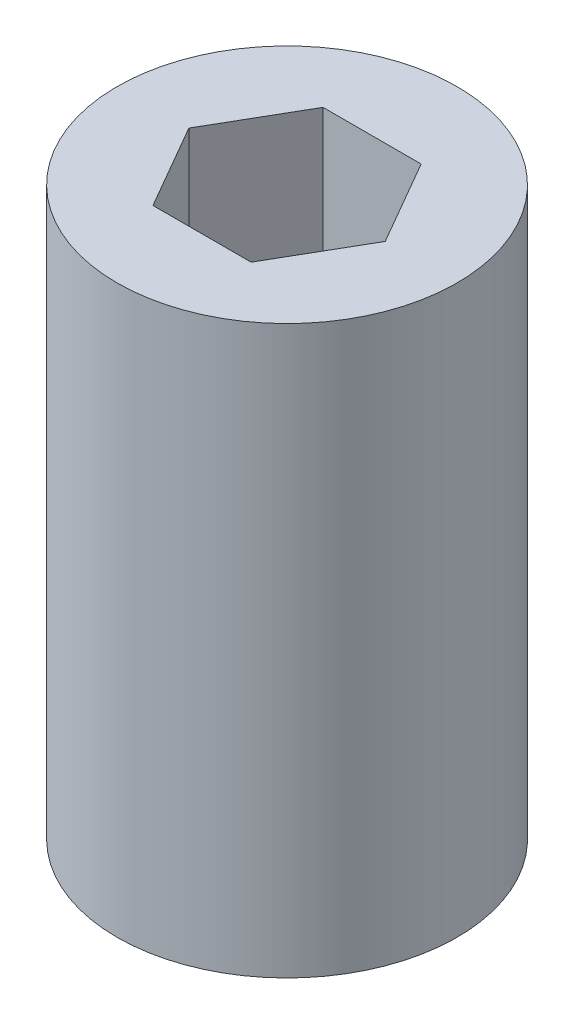
ISO-10303-21;
HEADER;
FILE_DESCRIPTION(('STEP AP214'),'2;1');
FILE_NAME('part.step','',(''),(''),'','','');
FILE_SCHEMA(('AUTOMOTIVE_DESIGN { 1 0 10303 214 1 1 1 1 }'));
ENDSEC;
DATA;
#1=APPLICATION_CONTEXT('core data for automotive mechanical design processes');
#2=APPLICATION_PROTOCOL_DEFINITION('international standard','automotive_design',2000,#1);
#3=PRODUCT_CONTEXT('',#1,'mechanical');
#4=PRODUCT('Part','Part','',(#3));
#5=PRODUCT_RELATED_PRODUCT_CATEGORY('part','',(#4));
#6=PRODUCT_DEFINITION_FORMATION('','',#4);
#7=PRODUCT_DEFINITION_CONTEXT('part definition',#1,'design');
#8=PRODUCT_DEFINITION('design','',#6,#7);
#9=PRODUCT_DEFINITION_SHAPE('','',#8);
#10=(LENGTH_UNIT() NAMED_UNIT(*) SI_UNIT(.MILLI.,.METRE.));
#11=(NAMED_UNIT(*) PLANE_ANGLE_UNIT() SI_UNIT($,.RADIAN.));
#12=(NAMED_UNIT(*) SI_UNIT($,.STERADIAN.) SOLID_ANGLE_UNIT());
#13=UNCERTAINTY_MEASURE_WITH_UNIT(LENGTH_MEASURE(1.E-05),#10,'distance_accuracy_value','');
#14=(GEOMETRIC_REPRESENTATION_CONTEXT(3) GLOBAL_UNCERTAINTY_ASSIGNED_CONTEXT((#13)) GLOBAL_UNIT_ASSIGNED_CONTEXT((#10,
#11,#12)) REPRESENTATION_CONTEXT('',''));
#15=CARTESIAN_POINT('',(0.,0.,0.));
#16=DIRECTION('',(0.,0.,1.));
#17=DIRECTION('',(1.,0.,0.));
#18=AXIS2_PLACEMENT_3D('',#15,#16,#17);
#19=CARTESIAN_POINT('',(0.,-5.5,0.));
#20=DIRECTION('',(0.,1.,0.));
#21=DIRECTION('',(0.,0.,1.));
#22=AXIS2_PLACEMENT_3D('',#19,#20,#21);
#23=CYLINDRICAL_SURFACE('',#22,0.75);
#24=CARTESIAN_POINT('',(0.,-5.5,0.));
#25=DIRECTION('',(0.,-1.,0.));
#26=DIRECTION('',(0.,0.,-1.));
#27=AXIS2_PLACEMENT_3D('',#24,#25,#26);
#28=CIRCLE('',#27,0.75);
#29=CARTESIAN_POINT('',(0.,-5.5,-0.75));
#30=VERTEX_POINT('',#29);
#31=EDGE_CURVE('E11',#30,#30,#28,.T.);
#32=ORIENTED_EDGE('',*,*,#31,.F.);
#33=EDGE_LOOP('',(#32));
#34=FACE_BOUND('',#33,.T.);
#35=CARTESIAN_POINT('',(0.,-5.,0.));
#36=DIRECTION('',(0.,-1.,0.));
#37=DIRECTION('',(0.,0.,-1.));
#38=AXIS2_PLACEMENT_3D('',#35,#36,#37);
#39=CIRCLE('',#38,0.75);
#40=CARTESIAN_POINT('',(0.,-5.,-0.75));
#41=VERTEX_POINT('',#40);
#42=EDGE_CURVE('E47',#41,#41,#39,.T.);
#43=ORIENTED_EDGE('',*,*,#42,.T.);
#44=EDGE_LOOP('',(#43));
#45=FACE_BOUND('',#44,.T.);
#46=ADVANCED_FACE('F44',(#34,#45),#23,.T.);
#47=CARTESIAN_POINT('',(0.,-5.5,0.));
#48=DIRECTION('',(0.,-1.,0.));
#49=DIRECTION('',(0.,0.,-1.));
#50=AXIS2_PLACEMENT_3D('',#47,#48,#49);
#51=PLANE('',#50);
#52=ORIENTED_EDGE('',*,*,#31,.T.);
#53=EDGE_LOOP('',(#52));
#54=FACE_BOUND('',#53,.T.);
#55=ADVANCED_FACE('F59',(#54),#51,.T.);
#56=CARTESIAN_POINT('',(0.,-5.,0.));
#57=DIRECTION('',(0.,-1.,0.));
#58=DIRECTION('',(0.,0.,-1.));
#59=AXIS2_PLACEMENT_3D('',#56,#57,#58);
#60=PLANE('',#59);
#61=ORIENTED_EDGE('',*,*,#42,.F.);
#62=EDGE_LOOP('',(#61));
#63=FACE_BOUND('',#62,.T.);
#64=ADVANCED_FACE('F57',(#63),#60,.F.);
#65=CLOSED_SHELL('',(#46,#55,#64));
#66=MANIFOLD_SOLID_BREP('B2',#65);
#67=CARTESIAN_POINT('',(0.,-5.,0.));
#68=DIRECTION('',(0.,1.,0.));
#69=DIRECTION('',(0.,0.,1.));
#70=AXIS2_PLACEMENT_3D('',#67,#68,#69);
#71=PLANE('',#70);
#72=CARTESIAN_POINT('',(0.,-5.,0.));
#73=DIRECTION('',(0.,1.,0.));
#74=DIRECTION('',(0.,0.,1.));
#75=AXIS2_PLACEMENT_3D('',#72,#73,#74);
#76=CIRCLE('',#75,1.50000000000001);
#77=CARTESIAN_POINT('',(0.,-5.,1.50000000000001));
#78=VERTEX_POINT('',#77);
#79=EDGE_CURVE('E42',#78,#78,#76,.T.);
#80=ORIENTED_EDGE('',*,*,#79,.F.);
#81=EDGE_LOOP('',(#80));
#82=FACE_BOUND('',#81,.T.);
#83=ADVANCED_FACE('F84',(#82),#71,.F.);
#84=CARTESIAN_POINT('',(0.,61.6916426261037,0.));
#85=DIRECTION('',(0.,1.,0.));
#86=DIRECTION('',(0.,0.,1.));
#87=AXIS2_PLACEMENT_3D('',#84,#85,#86);
#88=CYLINDRICAL_SURFACE('',#87,1.50000000000001);
#89=CARTESIAN_POINT('',(0.,0.,0.));
#90=DIRECTION('',(0.,1.,0.));
#91=DIRECTION('',(0.,0.,1.));
#92=AXIS2_PLACEMENT_3D('',#89,#90,#91);
#93=CIRCLE('',#92,1.50000000000001);
#94=CARTESIAN_POINT('',(0.,0.,1.50000000000001));
#95=VERTEX_POINT('',#94);
#96=EDGE_CURVE('E91',#95,#95,#93,.T.);
#97=ORIENTED_EDGE('',*,*,#96,.F.);
#98=EDGE_LOOP('',(#97));
#99=FACE_BOUND('',#98,.T.);
#100=ORIENTED_EDGE('',*,*,#79,.T.);
#101=EDGE_LOOP('',(#100));
#102=FACE_BOUND('',#101,.T.);
#103=ADVANCED_FACE('F194',(#99,#102),#88,.T.);
#104=CARTESIAN_POINT('',(1.50000000000001,0.,0.));
#105=DIRECTION('',(0.,-1.,0.));
#106=DIRECTION('',(0.,0.,-1.));
#107=AXIS2_PLACEMENT_3D('',#104,#105,#106);
#108=PLANE('',#107);
#109=DIRECTION('',(-1.,0.,0.));
#110=VECTOR('',#109,1.);
#111=CARTESIAN_POINT('',(0.433012701892219,0.,-0.75));
#112=LINE('',#111,#110);
#113=CARTESIAN_POINT('',(0.433012701892219,0.,-0.75));
#114=VERTEX_POINT('',#113);
#115=CARTESIAN_POINT('',(-0.433012701892219,0.,-0.75));
#116=VERTEX_POINT('',#115);
#117=EDGE_CURVE('E172',#114,#116,#112,.T.);
#118=ORIENTED_EDGE('',*,*,#117,.F.);
#119=DIRECTION('',(-0.5,0.,-0.866025403784439));
#120=VECTOR('',#119,1.);
#121=CARTESIAN_POINT('',(0.866025403784439,0.,0.));
#122=LINE('',#121,#120);
#123=CARTESIAN_POINT('',(0.866025403784439,0.,0.));
#124=VERTEX_POINT('',#123);
#125=EDGE_CURVE('E98',#124,#114,#122,.T.);
#126=ORIENTED_EDGE('',*,*,#125,.F.);
#127=DIRECTION('',(0.5,0.,-0.866025403784439));
#128=VECTOR('',#127,1.);
#129=CARTESIAN_POINT('',(0.433012701892219,0.,0.75));
#130=LINE('',#129,#128);
#131=CARTESIAN_POINT('',(0.433012701892219,0.,0.75));
#132=VERTEX_POINT('',#131);
#133=EDGE_CURVE('E181',#132,#124,#130,.T.);
#134=ORIENTED_EDGE('',*,*,#133,.F.);
#135=DIRECTION('',(1.,0.,0.));
#136=VECTOR('',#135,1.);
#137=CARTESIAN_POINT('',(-0.433012701892219,0.,0.75));
#138=LINE('',#137,#136);
#139=CARTESIAN_POINT('',(-0.433012701892219,0.,0.75));
#140=VERTEX_POINT('',#139);
#141=EDGE_CURVE('E179',#140,#132,#138,.T.);
#142=ORIENTED_EDGE('',*,*,#141,.F.);
#143=DIRECTION('',(0.5,0.,0.866025403784438));
#144=VECTOR('',#143,1.);
#145=CARTESIAN_POINT('',(-0.866025403784438,0.,0.));
#146=LINE('',#145,#144);
#147=CARTESIAN_POINT('',(-0.866025403784438,0.,0.));
#148=VERTEX_POINT('',#147);
#149=EDGE_CURVE('E146',#148,#140,#146,.T.);
#150=ORIENTED_EDGE('',*,*,#149,.F.);
#151=DIRECTION('',(-0.5,0.,0.866025403784439));
#152=VECTOR('',#151,1.);
#153=CARTESIAN_POINT('',(-0.433012701892219,0.,-0.75));
#154=LINE('',#153,#152);
#155=EDGE_CURVE('E175',#116,#148,#154,.T.);
#156=ORIENTED_EDGE('',*,*,#155,.F.);
#157=EDGE_LOOP('',(#118,#126,#134,#142,#150,#156));
#158=FACE_BOUND('',#157,.T.);
#159=ORIENTED_EDGE('',*,*,#96,.T.);
#160=EDGE_LOOP('',(#159));
#161=FACE_BOUND('',#160,.T.);
#162=ADVANCED_FACE('F192',(#158,#161),#108,.F.);
#163=CARTESIAN_POINT('',(0.866025403784439,-2.,0.));
#164=DIRECTION('',(0.866025403784439,0.,-0.5));
#165=DIRECTION('',(-0.5,0.,-0.866025403784439));
#166=AXIS2_PLACEMENT_3D('',#163,#164,#165);
#167=PLANE('',#166);
#168=ORIENTED_EDGE('',*,*,#125,.T.);
#169=DIRECTION('',(0.,1.,0.));
#170=VECTOR('',#169,1.);
#171=CARTESIAN_POINT('',(0.433012701892219,-2.,-0.75));
#172=LINE('',#171,#170);
#173=CARTESIAN_POINT('',(0.433012701892219,-2.,-0.75));
#174=VERTEX_POINT('',#173);
#175=EDGE_CURVE('E128',#174,#114,#172,.T.);
#176=ORIENTED_EDGE('',*,*,#175,.F.);
#177=DIRECTION('',(-0.5,0.,-0.866025403784439));
#178=VECTOR('',#177,1.);
#179=CARTESIAN_POINT('',(0.866025403784439,-2.,0.));
#180=LINE('',#179,#178);
#181=CARTESIAN_POINT('',(0.866025403784439,-2.,0.));
#182=VERTEX_POINT('',#181);
#183=EDGE_CURVE('E183',#182,#174,#180,.T.);
#184=ORIENTED_EDGE('',*,*,#183,.F.);
#185=DIRECTION('',(0.,1.,0.));
#186=VECTOR('',#185,1.);
#187=CARTESIAN_POINT('',(0.866025403784439,-2.,0.));
#188=LINE('',#187,#186);
#189=EDGE_CURVE('E106',#182,#124,#188,.T.);
#190=ORIENTED_EDGE('',*,*,#189,.T.);
#191=EDGE_LOOP('',(#168,#176,#184,#190));
#192=FACE_BOUND('',#191,.T.);
#193=ADVANCED_FACE('F212',(#192),#167,.F.);
#194=CARTESIAN_POINT('',(0.433012701892219,-2.,0.75));
#195=DIRECTION('',(0.866025403784439,0.,0.5));
#196=DIRECTION('',(0.5,0.,-0.866025403784439));
#197=AXIS2_PLACEMENT_3D('',#194,#195,#196);
#198=PLANE('',#197);
#199=ORIENTED_EDGE('',*,*,#133,.T.);
#200=ORIENTED_EDGE('',*,*,#189,.F.);
#201=DIRECTION('',(0.5,0.,-0.866025403784439));
#202=VECTOR('',#201,1.);
#203=CARTESIAN_POINT('',(0.433012701892219,-2.,0.75));
#204=LINE('',#203,#202);
#205=CARTESIAN_POINT('',(0.433012701892219,-2.,0.75));
#206=VERTEX_POINT('',#205);
#207=EDGE_CURVE('E158',#206,#182,#204,.T.);
#208=ORIENTED_EDGE('',*,*,#207,.F.);
#209=DIRECTION('',(0.,1.,0.));
#210=VECTOR('',#209,1.);
#211=CARTESIAN_POINT('',(0.433012701892219,-2.,0.75));
#212=LINE('',#211,#210);
#213=EDGE_CURVE('E150',#206,#132,#212,.T.);
#214=ORIENTED_EDGE('',*,*,#213,.T.);
#215=EDGE_LOOP('',(#199,#200,#208,#214));
#216=FACE_BOUND('',#215,.T.);
#217=ADVANCED_FACE('F220',(#216),#198,.F.);
#218=CARTESIAN_POINT('',(-0.433012701892219,-2.,0.75));
#219=DIRECTION('',(0.,0.,1.));
#220=DIRECTION('',(1.,0.,0.));
#221=AXIS2_PLACEMENT_3D('',#218,#219,#220);
#222=PLANE('',#221);
#223=ORIENTED_EDGE('',*,*,#141,.T.);
#224=ORIENTED_EDGE('',*,*,#213,.F.);
#225=DIRECTION('',(1.,0.,0.));
#226=VECTOR('',#225,1.);
#227=CARTESIAN_POINT('',(-0.433012701892219,-2.,0.75));
#228=LINE('',#227,#226);
#229=CARTESIAN_POINT('',(-0.433012701892219,-2.,0.75));
#230=VERTEX_POINT('',#229);
#231=EDGE_CURVE('E154',#230,#206,#228,.T.);
#232=ORIENTED_EDGE('',*,*,#231,.F.);
#233=DIRECTION('',(0.,1.,0.));
#234=VECTOR('',#233,1.);
#235=CARTESIAN_POINT('',(-0.433012701892219,-2.,0.75));
#236=LINE('',#235,#234);
#237=EDGE_CURVE('E139',#230,#140,#236,.T.);
#238=ORIENTED_EDGE('',*,*,#237,.T.);
#239=EDGE_LOOP('',(#223,#224,#232,#238));
#240=FACE_BOUND('',#239,.T.);
#241=ADVANCED_FACE('F155',(#240),#222,.F.);
#242=CARTESIAN_POINT('',(-0.866025403784438,-2.,0.));
#243=DIRECTION('',(-0.866025403784438,0.,0.5));
#244=DIRECTION('',(0.5,0.,0.866025403784439));
#245=AXIS2_PLACEMENT_3D('',#242,#243,#244);
#246=PLANE('',#245);
#247=ORIENTED_EDGE('',*,*,#149,.T.);
#248=ORIENTED_EDGE('',*,*,#237,.F.);
#249=DIRECTION('',(0.5,0.,0.866025403784438));
#250=VECTOR('',#249,1.);
#251=CARTESIAN_POINT('',(-0.866025403784438,-2.,0.));
#252=LINE('',#251,#250);
#253=CARTESIAN_POINT('',(-0.866025403784438,-2.,0.));
#254=VERTEX_POINT('',#253);
#255=EDGE_CURVE('E143',#254,#230,#252,.T.);
#256=ORIENTED_EDGE('',*,*,#255,.F.);
#257=DIRECTION('',(0.,1.,0.));
#258=VECTOR('',#257,1.);
#259=CARTESIAN_POINT('',(-0.866025403784438,-2.,0.));
#260=LINE('',#259,#258);
#261=EDGE_CURVE('E151',#254,#148,#260,.T.);
#262=ORIENTED_EDGE('',*,*,#261,.T.);
#263=EDGE_LOOP('',(#247,#248,#256,#262));
#264=FACE_BOUND('',#263,.T.);
#265=ADVANCED_FACE('F141',(#264),#246,.F.);
#266=CARTESIAN_POINT('',(-0.433012701892219,-2.,-0.75));
#267=DIRECTION('',(-0.866025403784439,0.,-0.5));
#268=DIRECTION('',(-0.5,0.,0.866025403784439));
#269=AXIS2_PLACEMENT_3D('',#266,#267,#268);
#270=PLANE('',#269);
#271=ORIENTED_EDGE('',*,*,#155,.T.);
#272=ORIENTED_EDGE('',*,*,#261,.F.);
#273=DIRECTION('',(-0.5,0.,0.866025403784439));
#274=VECTOR('',#273,1.);
#275=CARTESIAN_POINT('',(-0.433012701892219,-2.,-0.75));
#276=LINE('',#275,#274);
#277=CARTESIAN_POINT('',(-0.433012701892219,-2.,-0.75));
#278=VERTEX_POINT('',#277);
#279=EDGE_CURVE('E164',#278,#254,#276,.T.);
#280=ORIENTED_EDGE('',*,*,#279,.F.);
#281=DIRECTION('',(0.,1.,0.));
#282=VECTOR('',#281,1.);
#283=CARTESIAN_POINT('',(-0.433012701892219,-2.,-0.75));
#284=LINE('',#283,#282);
#285=EDGE_CURVE('E187',#278,#116,#284,.T.);
#286=ORIENTED_EDGE('',*,*,#285,.T.);
#287=EDGE_LOOP('',(#271,#272,#280,#286));
#288=FACE_BOUND('',#287,.T.);
#289=ADVANCED_FACE('F239',(#288),#270,.F.);
#290=CARTESIAN_POINT('',(0.433012701892219,-2.,-0.75));
#291=DIRECTION('',(0.,0.,-1.));
#292=DIRECTION('',(-1.,0.,0.));
#293=AXIS2_PLACEMENT_3D('',#290,#291,#292);
#294=PLANE('',#293);
#295=ORIENTED_EDGE('',*,*,#117,.T.);
#296=ORIENTED_EDGE('',*,*,#285,.F.);
#297=DIRECTION('',(-1.,0.,0.));
#298=VECTOR('',#297,1.);
#299=CARTESIAN_POINT('',(0.433012701892219,-2.,-0.75));
#300=LINE('',#299,#298);
#301=EDGE_CURVE('E166',#174,#278,#300,.T.);
#302=ORIENTED_EDGE('',*,*,#301,.F.);
#303=ORIENTED_EDGE('',*,*,#175,.T.);
#304=EDGE_LOOP('',(#295,#296,#302,#303));
#305=FACE_BOUND('',#304,.T.);
#306=ADVANCED_FACE('F246',(#305),#294,.F.);
#307=CARTESIAN_POINT('',(0.433012701892219,-2.,-0.75));
#308=DIRECTION('',(0.,1.,0.));
#309=DIRECTION('',(0.,0.,1.));
#310=AXIS2_PLACEMENT_3D('',#307,#308,#309);
#311=PLANE('',#310);
#312=ORIENTED_EDGE('',*,*,#183,.T.);
#313=ORIENTED_EDGE('',*,*,#301,.T.);
#314=ORIENTED_EDGE('',*,*,#279,.T.);
#315=ORIENTED_EDGE('',*,*,#255,.T.);
#316=ORIENTED_EDGE('',*,*,#231,.T.);
#317=ORIENTED_EDGE('',*,*,#207,.T.);
#318=EDGE_LOOP('',(#312,#313,#314,#315,#316,#317));
#319=FACE_BOUND('',#318,.T.);
#320=ADVANCED_FACE('F161',(#319),#311,.T.);
#321=CLOSED_SHELL('',(#83,#103,#162,#193,#217,#241,#265,#289,#306,#320));
#322=MANIFOLD_SOLID_BREP('B6',#321);
#323=ADVANCED_BREP_SHAPE_REPRESENTATION('',(#18,#66,#322),#14);
#324=SHAPE_DEFINITION_REPRESENTATION(#9,#323);
ENDSEC;
END-ISO-10303-21;
